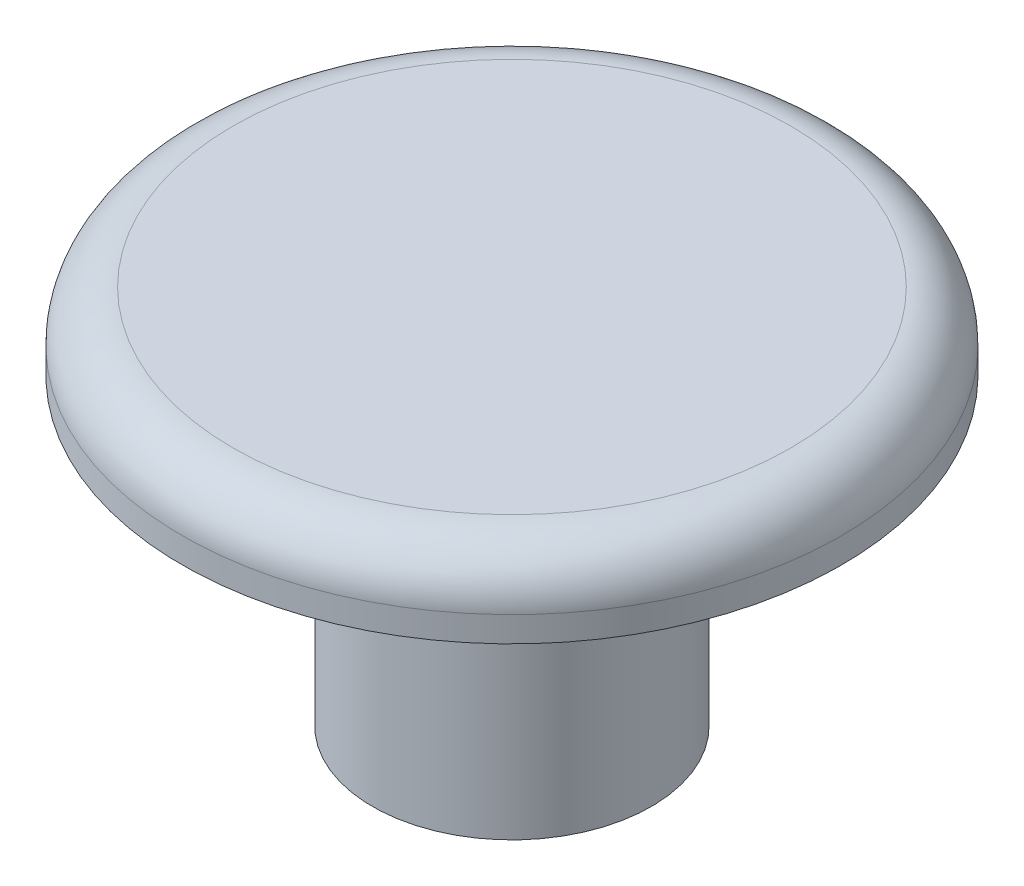
ISO-10303-21;
HEADER;
FILE_DESCRIPTION(('STEP AP214'),'2;1');
FILE_NAME('part.step','',(''),(''),'','','');
FILE_SCHEMA(('AUTOMOTIVE_DESIGN { 1 0 10303 214 1 1 1 1 }'));
ENDSEC;
DATA;
#1=APPLICATION_CONTEXT('core data for automotive mechanical design processes');
#2=APPLICATION_PROTOCOL_DEFINITION('international standard','automotive_design',2000,#1);
#3=PRODUCT_CONTEXT('',#1,'mechanical');
#4=PRODUCT('Part','Part','',(#3));
#5=PRODUCT_RELATED_PRODUCT_CATEGORY('part','',(#4));
#6=PRODUCT_DEFINITION_FORMATION('','',#4);
#7=PRODUCT_DEFINITION_CONTEXT('part definition',#1,'design');
#8=PRODUCT_DEFINITION('design','',#6,#7);
#9=PRODUCT_DEFINITION_SHAPE('','',#8);
#10=(LENGTH_UNIT() NAMED_UNIT(*) SI_UNIT(.MILLI.,.METRE.));
#11=(NAMED_UNIT(*) PLANE_ANGLE_UNIT() SI_UNIT($,.RADIAN.));
#12=(NAMED_UNIT(*) SI_UNIT($,.STERADIAN.) SOLID_ANGLE_UNIT());
#13=UNCERTAINTY_MEASURE_WITH_UNIT(LENGTH_MEASURE(1.E-05),#10,'distance_accuracy_value','');
#14=(GEOMETRIC_REPRESENTATION_CONTEXT(3) GLOBAL_UNCERTAINTY_ASSIGNED_CONTEXT((#13)) GLOBAL_UNIT_ASSIGNED_CONTEXT((#10,
#11,#12)) REPRESENTATION_CONTEXT('',''));
#15=CARTESIAN_POINT('',(0.,0.,0.));
#16=DIRECTION('',(0.,0.,1.));
#17=DIRECTION('',(1.,0.,0.));
#18=AXIS2_PLACEMENT_3D('',#15,#16,#17);
#19=CARTESIAN_POINT('',(0.,15.,0.));
#20=DIRECTION('',(0.,1.,0.));
#21=DIRECTION('',(0.,0.,1.));
#22=AXIS2_PLACEMENT_3D('',#19,#20,#21);
#23=PLANE('',#22);
#24=CARTESIAN_POINT('',(0.,15.,0.));
#25=DIRECTION('',(0.,-1.,0.));
#26=DIRECTION('',(0.,0.,-1.));
#27=AXIS2_PLACEMENT_3D('',#24,#25,#26);
#28=CIRCLE('',#27,11.);
#29=CARTESIAN_POINT('',(0.,15.,-11.));
#30=VERTEX_POINT('',#29);
#31=EDGE_CURVE('E10',#30,#30,#28,.T.);
#32=ORIENTED_EDGE('',*,*,#31,.F.);
#33=EDGE_LOOP('',(#32));
#34=FACE_BOUND('',#33,.T.);
#35=ADVANCED_FACE('F32',(#34),#23,.T.);
#36=CARTESIAN_POINT('',(0.,13.,0.));
#37=DIRECTION('',(0.,-1.,0.));
#38=DIRECTION('',(0.,0.,-1.));
#39=AXIS2_PLACEMENT_3D('',#36,#37,#38);
#40=TOROIDAL_SURFACE('',#39,11.,2.);
#41=ORIENTED_EDGE('',*,*,#31,.T.);
#42=EDGE_LOOP('',(#41));
#43=FACE_BOUND('',#42,.T.);
#44=CARTESIAN_POINT('',(0.,13.,0.));
#45=DIRECTION('',(0.,-1.,0.));
#46=DIRECTION('',(0.,0.,-1.));
#47=AXIS2_PLACEMENT_3D('',#44,#45,#46);
#48=CIRCLE('',#47,13.);
#49=CARTESIAN_POINT('',(0.,13.,-13.));
#50=VERTEX_POINT('',#49);
#51=EDGE_CURVE('E39',#50,#50,#48,.T.);
#52=ORIENTED_EDGE('',*,*,#51,.F.);
#53=EDGE_LOOP('',(#52));
#54=FACE_BOUND('',#53,.T.);
#55=ADVANCED_FACE('F79',(#43,#54),#40,.T.);
#56=CARTESIAN_POINT('',(0.,0.,0.));
#57=DIRECTION('',(0.,-1.,0.));
#58=DIRECTION('',(0.,0.,-1.));
#59=AXIS2_PLACEMENT_3D('',#56,#57,#58);
#60=CYLINDRICAL_SURFACE('',#59,13.);
#61=ORIENTED_EDGE('',*,*,#51,.T.);
#62=EDGE_LOOP('',(#61));
#63=FACE_BOUND('',#62,.T.);
#64=CARTESIAN_POINT('',(0.,12.,0.));
#65=DIRECTION('',(0.,-1.,0.));
#66=DIRECTION('',(0.,0.,-1.));
#67=AXIS2_PLACEMENT_3D('',#64,#65,#66);
#68=CIRCLE('',#67,13.);
#69=CARTESIAN_POINT('',(0.,12.,-13.));
#70=VERTEX_POINT('',#69);
#71=EDGE_CURVE('E45',#70,#70,#68,.T.);
#72=ORIENTED_EDGE('',*,*,#71,.F.);
#73=EDGE_LOOP('',(#72));
#74=FACE_BOUND('',#73,.T.);
#75=ADVANCED_FACE('F75',(#63,#74),#60,.T.);
#76=CARTESIAN_POINT('',(13.,12.,0.));
#77=DIRECTION('',(0.,-1.,0.));
#78=DIRECTION('',(0.,0.,-1.));
#79=AXIS2_PLACEMENT_3D('',#76,#77,#78);
#80=PLANE('',#79);
#81=ORIENTED_EDGE('',*,*,#71,.T.);
#82=EDGE_LOOP('',(#81));
#83=FACE_BOUND('',#82,.T.);
#84=CARTESIAN_POINT('',(0.,12.,0.));
#85=DIRECTION('',(0.,-1.,0.));
#86=DIRECTION('',(0.,0.,-1.));
#87=AXIS2_PLACEMENT_3D('',#84,#85,#86);
#88=CIRCLE('',#87,5.5);
#89=CARTESIAN_POINT('',(0.,12.,-5.5));
#90=VERTEX_POINT('',#89);
#91=EDGE_CURVE('E51',#90,#90,#88,.T.);
#92=ORIENTED_EDGE('',*,*,#91,.F.);
#93=EDGE_LOOP('',(#92));
#94=FACE_BOUND('',#93,.T.);
#95=ADVANCED_FACE('F67',(#83,#94),#80,.T.);
#96=CARTESIAN_POINT('',(0.,0.,0.));
#97=DIRECTION('',(0.,-1.,0.));
#98=DIRECTION('',(0.,0.,-1.));
#99=AXIS2_PLACEMENT_3D('',#96,#97,#98);
#100=CYLINDRICAL_SURFACE('',#99,5.5);
#101=ORIENTED_EDGE('',*,*,#91,.T.);
#102=EDGE_LOOP('',(#101));
#103=FACE_BOUND('',#102,.T.);
#104=CARTESIAN_POINT('',(0.,0.,0.));
#105=DIRECTION('',(0.,-1.,0.));
#106=DIRECTION('',(0.,0.,-1.));
#107=AXIS2_PLACEMENT_3D('',#104,#105,#106);
#108=CIRCLE('',#107,5.5);
#109=CARTESIAN_POINT('',(0.,0.,-5.5));
#110=VERTEX_POINT('',#109);
#111=EDGE_CURVE('E57',#110,#110,#108,.T.);
#112=ORIENTED_EDGE('',*,*,#111,.F.);
#113=EDGE_LOOP('',(#112));
#114=FACE_BOUND('',#113,.T.);
#115=ADVANCED_FACE('F65',(#103,#114),#100,.T.);
#116=CARTESIAN_POINT('',(5.5,0.,0.));
#117=DIRECTION('',(0.,-1.,0.));
#118=DIRECTION('',(0.,0.,-1.));
#119=AXIS2_PLACEMENT_3D('',#116,#117,#118);
#120=PLANE('',#119);
#121=ORIENTED_EDGE('',*,*,#111,.T.);
#122=EDGE_LOOP('',(#121));
#123=FACE_BOUND('',#122,.T.);
#124=ADVANCED_FACE('F63',(#123),#120,.T.);
#125=CLOSED_SHELL('',(#35,#55,#75,#95,#115,#124));
#126=MANIFOLD_SOLID_BREP('B2',#125);
#127=ADVANCED_BREP_SHAPE_REPRESENTATION('',(#18,#126),#14);
#128=SHAPE_DEFINITION_REPRESENTATION(#9,#127);
ENDSEC;
END-ISO-10303-21;
